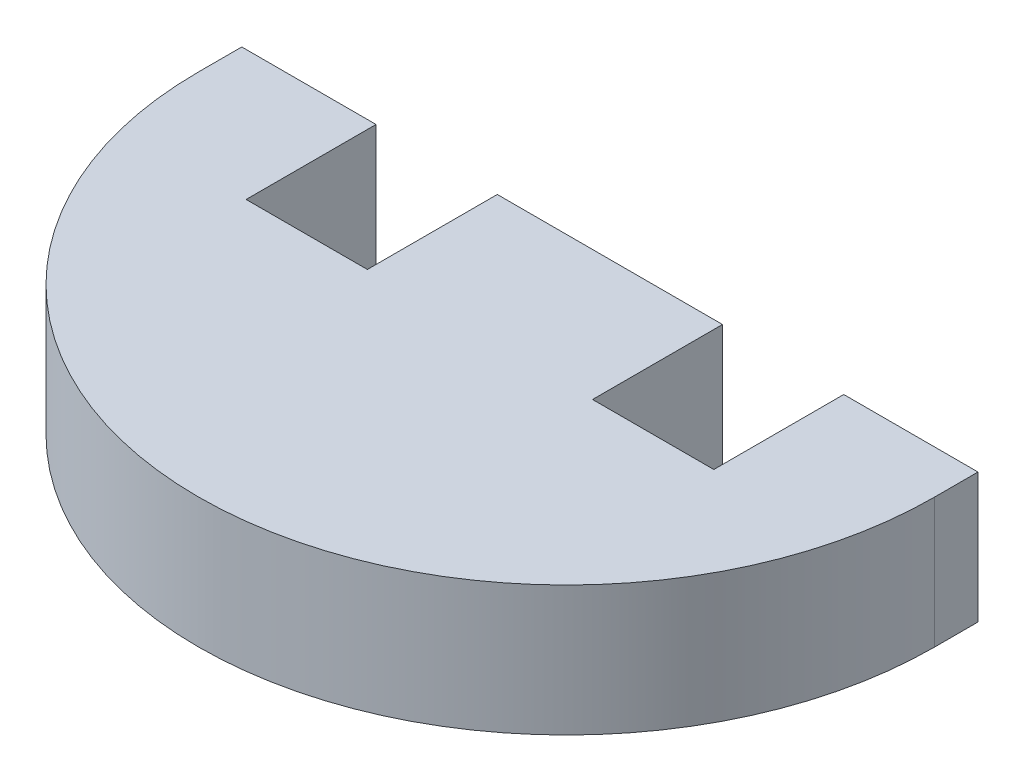
ISO-10303-21;
HEADER;
FILE_DESCRIPTION(('STEP AP214'),'2;1');
FILE_NAME('part.step','',(''),(''),'','','');
FILE_SCHEMA(('AUTOMOTIVE_DESIGN { 1 0 10303 214 1 1 1 1 }'));
ENDSEC;
DATA;
#1=APPLICATION_CONTEXT('core data for automotive mechanical design processes');
#2=APPLICATION_PROTOCOL_DEFINITION('international standard','automotive_design',2000,#1);
#3=PRODUCT_CONTEXT('',#1,'mechanical');
#4=PRODUCT('Part','Part','',(#3));
#5=PRODUCT_RELATED_PRODUCT_CATEGORY('part','',(#4));
#6=PRODUCT_DEFINITION_FORMATION('','',#4);
#7=PRODUCT_DEFINITION_CONTEXT('part definition',#1,'design');
#8=PRODUCT_DEFINITION('design','',#6,#7);
#9=PRODUCT_DEFINITION_SHAPE('','',#8);
#10=(LENGTH_UNIT() NAMED_UNIT(*) SI_UNIT(.MILLI.,.METRE.));
#11=(NAMED_UNIT(*) PLANE_ANGLE_UNIT() SI_UNIT($,.RADIAN.));
#12=(NAMED_UNIT(*) SI_UNIT($,.STERADIAN.) SOLID_ANGLE_UNIT());
#13=UNCERTAINTY_MEASURE_WITH_UNIT(LENGTH_MEASURE(1.E-05),#10,'distance_accuracy_value','');
#14=(GEOMETRIC_REPRESENTATION_CONTEXT(3) GLOBAL_UNCERTAINTY_ASSIGNED_CONTEXT((#13)) GLOBAL_UNIT_ASSIGNED_CONTEXT((#10,
#11,#12)) REPRESENTATION_CONTEXT('',''));
#15=CARTESIAN_POINT('',(0.,0.,0.));
#16=DIRECTION('',(0.,0.,1.));
#17=DIRECTION('',(1.,0.,0.));
#18=AXIS2_PLACEMENT_3D('',#15,#16,#17);
#19=CARTESIAN_POINT('',(-8.5,3.,-1.));
#20=DIRECTION('',(0.,0.,1.));
#21=DIRECTION('',(1.,0.,0.));
#22=AXIS2_PLACEMENT_3D('',#19,#20,#21);
#23=PLANE('',#22);
#24=DIRECTION('',(-1.,0.,0.));
#25=VECTOR('',#24,1.);
#26=CARTESIAN_POINT('',(-8.5,3.,-1.));
#27=LINE('',#26,#25);
#28=CARTESIAN_POINT('',(-5.4,3.,-1.));
#29=VERTEX_POINT('',#28);
#30=CARTESIAN_POINT('',(-8.5,3.,-1.));
#31=VERTEX_POINT('',#30);
#32=EDGE_CURVE('E221',#29,#31,#27,.T.);
#33=ORIENTED_EDGE('',*,*,#32,.F.);
#34=DIRECTION('',(0.,1.,0.));
#35=VECTOR('',#34,1.);
#36=CARTESIAN_POINT('',(-5.4,0.,-1.));
#37=LINE('',#36,#35);
#38=CARTESIAN_POINT('',(-5.4,0.,-1.));
#39=VERTEX_POINT('',#38);
#40=EDGE_CURVE('E170',#39,#29,#37,.T.);
#41=ORIENTED_EDGE('',*,*,#40,.F.);
#42=DIRECTION('',(-1.,0.,0.));
#43=VECTOR('',#42,1.);
#44=CARTESIAN_POINT('',(-8.5,0.,-1.));
#45=LINE('',#44,#43);
#46=CARTESIAN_POINT('',(-8.5,0.,-1.));
#47=VERTEX_POINT('',#46);
#48=EDGE_CURVE('E155',#39,#47,#45,.T.);
#49=ORIENTED_EDGE('',*,*,#48,.T.);
#50=DIRECTION('',(0.,-1.,0.));
#51=VECTOR('',#50,1.);
#52=CARTESIAN_POINT('',(-8.5,3.,-1.));
#53=LINE('',#52,#51);
#54=EDGE_CURVE('E247',#31,#47,#53,.T.);
#55=ORIENTED_EDGE('',*,*,#54,.F.);
#56=EDGE_LOOP('',(#33,#41,#49,#55));
#57=FACE_BOUND('',#56,.T.);
#58=ADVANCED_FACE('F43',(#57),#23,.F.);
#59=CARTESIAN_POINT('',(8.5,0.,-1.));
#60=VERTEX_POINT('',#59);
#61=CARTESIAN_POINT('',(5.4,0.,-1.));
#62=VERTEX_POINT('',#61);
#63=EDGE_CURVE('E237',#60,#62,#45,.T.);
#64=ORIENTED_EDGE('',*,*,#63,.T.);
#65=DIRECTION('',(0.,1.,0.));
#66=VECTOR('',#65,1.);
#67=CARTESIAN_POINT('',(5.4,0.,-1.));
#68=LINE('',#67,#66);
#69=CARTESIAN_POINT('',(5.4,3.,-1.));
#70=VERTEX_POINT('',#69);
#71=EDGE_CURVE('E180',#62,#70,#68,.T.);
#72=ORIENTED_EDGE('',*,*,#71,.T.);
#73=CARTESIAN_POINT('',(8.5,3.,-1.));
#74=VERTEX_POINT('',#73);
#75=EDGE_CURVE('E222',#74,#70,#27,.T.);
#76=ORIENTED_EDGE('',*,*,#75,.F.);
#77=DIRECTION('',(0.,-1.,0.));
#78=VECTOR('',#77,1.);
#79=CARTESIAN_POINT('',(8.5,3.,-1.));
#80=LINE('',#79,#78);
#81=EDGE_CURVE('E52',#74,#60,#80,.T.);
#82=ORIENTED_EDGE('',*,*,#81,.T.);
#83=EDGE_LOOP('',(#64,#72,#76,#82));
#84=FACE_BOUND('',#83,.T.);
#85=ADVANCED_FACE('F256',(#84),#23,.F.);
#86=CARTESIAN_POINT('',(0.,3.,0.));
#87=DIRECTION('',(0.,-1.,0.));
#88=DIRECTION('',(0.,0.,-1.));
#89=AXIS2_PLACEMENT_3D('',#86,#87,#88);
#90=CYLINDRICAL_SURFACE('',#89,8.5);
#91=CARTESIAN_POINT('',(0.,0.,0.));
#92=DIRECTION('',(0.,1.,0.));
#93=DIRECTION('',(0.,0.,1.));
#94=AXIS2_PLACEMENT_3D('',#91,#92,#93);
#95=CIRCLE('',#94,8.5);
#96=CARTESIAN_POINT('',(-8.5,0.,0.));
#97=VERTEX_POINT('',#96);
#98=CARTESIAN_POINT('',(8.5,0.,0.));
#99=VERTEX_POINT('',#98);
#100=EDGE_CURVE('E173',#97,#99,#95,.T.);
#101=ORIENTED_EDGE('',*,*,#100,.T.);
#102=DIRECTION('',(0.,-1.,0.));
#103=VECTOR('',#102,1.);
#104=CARTESIAN_POINT('',(8.5,3.,0.));
#105=LINE('',#104,#103);
#106=CARTESIAN_POINT('',(8.5,3.,0.));
#107=VERTEX_POINT('',#106);
#108=EDGE_CURVE('E11',#107,#99,#105,.T.);
#109=ORIENTED_EDGE('',*,*,#108,.F.);
#110=CARTESIAN_POINT('',(0.,3.,0.));
#111=DIRECTION('',(0.,1.,0.));
#112=DIRECTION('',(0.,0.,1.));
#113=AXIS2_PLACEMENT_3D('',#110,#111,#112);
#114=CIRCLE('',#113,8.5);
#115=CARTESIAN_POINT('',(-8.5,3.,0.));
#116=VERTEX_POINT('',#115);
#117=EDGE_CURVE('E213',#116,#107,#114,.T.);
#118=ORIENTED_EDGE('',*,*,#117,.F.);
#119=DIRECTION('',(0.,-1.,0.));
#120=VECTOR('',#119,1.);
#121=CARTESIAN_POINT('',(-8.5,3.,0.));
#122=LINE('',#121,#120);
#123=EDGE_CURVE('E230',#116,#97,#122,.T.);
#124=ORIENTED_EDGE('',*,*,#123,.T.);
#125=EDGE_LOOP('',(#101,#109,#118,#124));
#126=FACE_BOUND('',#125,.T.);
#127=ADVANCED_FACE('F45',(#126),#90,.T.);
#128=CARTESIAN_POINT('',(8.5,3.,-1.));
#129=DIRECTION('',(-1.,0.,0.));
#130=DIRECTION('',(0.,0.,1.));
#131=AXIS2_PLACEMENT_3D('',#128,#129,#130);
#132=PLANE('',#131);
#133=DIRECTION('',(0.,0.,-1.));
#134=VECTOR('',#133,1.);
#135=CARTESIAN_POINT('',(8.5,0.,-1.));
#136=LINE('',#135,#134);
#137=EDGE_CURVE('E234',#99,#60,#136,.T.);
#138=ORIENTED_EDGE('',*,*,#137,.T.);
#139=ORIENTED_EDGE('',*,*,#81,.F.);
#140=DIRECTION('',(0.,0.,-1.));
#141=VECTOR('',#140,1.);
#142=CARTESIAN_POINT('',(8.5,3.,-1.));
#143=LINE('',#142,#141);
#144=EDGE_CURVE('E217',#107,#74,#143,.T.);
#145=ORIENTED_EDGE('',*,*,#144,.F.);
#146=ORIENTED_EDGE('',*,*,#108,.T.);
#147=EDGE_LOOP('',(#138,#139,#145,#146));
#148=FACE_BOUND('',#147,.T.);
#149=ADVANCED_FACE('F268',(#148),#132,.F.);
#150=CARTESIAN_POINT('',(2.6,0.,-1.));
#151=VERTEX_POINT('',#150);
#152=CARTESIAN_POINT('',(-2.6,0.,-1.));
#153=VERTEX_POINT('',#152);
#154=EDGE_CURVE('E241',#151,#153,#45,.T.);
#155=ORIENTED_EDGE('',*,*,#154,.T.);
#156=DIRECTION('',(0.,1.,0.));
#157=VECTOR('',#156,1.);
#158=CARTESIAN_POINT('',(-2.6,0.,-1.));
#159=LINE('',#158,#157);
#160=CARTESIAN_POINT('',(-2.6,3.,-1.));
#161=VERTEX_POINT('',#160);
#162=EDGE_CURVE('E174',#153,#161,#159,.T.);
#163=ORIENTED_EDGE('',*,*,#162,.T.);
#164=CARTESIAN_POINT('',(2.6,3.,-1.));
#165=VERTEX_POINT('',#164);
#166=EDGE_CURVE('E227',#165,#161,#27,.T.);
#167=ORIENTED_EDGE('',*,*,#166,.F.);
#168=DIRECTION('',(0.,1.,0.));
#169=VECTOR('',#168,1.);
#170=CARTESIAN_POINT('',(2.6,0.,-1.));
#171=LINE('',#170,#169);
#172=EDGE_CURVE('E184',#151,#165,#171,.T.);
#173=ORIENTED_EDGE('',*,*,#172,.F.);
#174=EDGE_LOOP('',(#155,#163,#167,#173));
#175=FACE_BOUND('',#174,.T.);
#176=ADVANCED_FACE('F283',(#175),#23,.F.);
#177=CARTESIAN_POINT('',(-8.5,3.,0.));
#178=DIRECTION('',(1.,0.,0.));
#179=DIRECTION('',(0.,0.,-1.));
#180=AXIS2_PLACEMENT_3D('',#177,#178,#179);
#181=PLANE('',#180);
#182=DIRECTION('',(0.,0.,1.));
#183=VECTOR('',#182,1.);
#184=CARTESIAN_POINT('',(-8.5,0.,0.));
#185=LINE('',#184,#183);
#186=EDGE_CURVE('E218',#47,#97,#185,.T.);
#187=ORIENTED_EDGE('',*,*,#186,.T.);
#188=ORIENTED_EDGE('',*,*,#123,.F.);
#189=DIRECTION('',(0.,0.,1.));
#190=VECTOR('',#189,1.);
#191=CARTESIAN_POINT('',(-8.5,3.,0.));
#192=LINE('',#191,#190);
#193=EDGE_CURVE('E226',#31,#116,#192,.T.);
#194=ORIENTED_EDGE('',*,*,#193,.F.);
#195=ORIENTED_EDGE('',*,*,#54,.T.);
#196=EDGE_LOOP('',(#187,#188,#194,#195));
#197=FACE_BOUND('',#196,.T.);
#198=ADVANCED_FACE('F272',(#197),#181,.F.);
#199=CARTESIAN_POINT('',(0.,3.,0.));
#200=DIRECTION('',(0.,1.,0.));
#201=DIRECTION('',(0.,0.,1.));
#202=AXIS2_PLACEMENT_3D('',#199,#200,#201);
#203=PLANE('',#202);
#204=DIRECTION('',(0.,0.,1.));
#205=VECTOR('',#204,1.);
#206=CARTESIAN_POINT('',(-5.4,3.,-1.));
#207=LINE('',#206,#205);
#208=CARTESIAN_POINT('',(-5.4,3.,2.));
#209=VERTEX_POINT('',#208);
#210=EDGE_CURVE('E139',#29,#209,#207,.T.);
#211=ORIENTED_EDGE('',*,*,#210,.F.);
#212=ORIENTED_EDGE('',*,*,#32,.T.);
#213=ORIENTED_EDGE('',*,*,#193,.T.);
#214=ORIENTED_EDGE('',*,*,#117,.T.);
#215=ORIENTED_EDGE('',*,*,#144,.T.);
#216=ORIENTED_EDGE('',*,*,#75,.T.);
#217=DIRECTION('',(0.,0.,-1.));
#218=VECTOR('',#217,1.);
#219=CARTESIAN_POINT('',(5.4,3.,-1.));
#220=LINE('',#219,#218);
#221=CARTESIAN_POINT('',(5.4,3.,2.));
#222=VERTEX_POINT('',#221);
#223=EDGE_CURVE('E167',#222,#70,#220,.T.);
#224=ORIENTED_EDGE('',*,*,#223,.F.);
#225=DIRECTION('',(1.,0.,0.));
#226=VECTOR('',#225,1.);
#227=CARTESIAN_POINT('',(5.4,3.,2.));
#228=LINE('',#227,#226);
#229=CARTESIAN_POINT('',(2.6,3.,2.));
#230=VERTEX_POINT('',#229);
#231=EDGE_CURVE('E193',#230,#222,#228,.T.);
#232=ORIENTED_EDGE('',*,*,#231,.F.);
#233=DIRECTION('',(0.,0.,1.));
#234=VECTOR('',#233,1.);
#235=CARTESIAN_POINT('',(2.6,3.,-1.));
#236=LINE('',#235,#234);
#237=EDGE_CURVE('E197',#165,#230,#236,.T.);
#238=ORIENTED_EDGE('',*,*,#237,.F.);
#239=ORIENTED_EDGE('',*,*,#166,.T.);
#240=DIRECTION('',(0.,0.,-1.));
#241=VECTOR('',#240,1.);
#242=CARTESIAN_POINT('',(-2.6,3.,-1.));
#243=LINE('',#242,#241);
#244=CARTESIAN_POINT('',(-2.6,3.,2.));
#245=VERTEX_POINT('',#244);
#246=EDGE_CURVE('E157',#245,#161,#243,.T.);
#247=ORIENTED_EDGE('',*,*,#246,.F.);
#248=DIRECTION('',(1.,0.,0.));
#249=VECTOR('',#248,1.);
#250=CARTESIAN_POINT('',(-5.4,3.,2.));
#251=LINE('',#250,#249);
#252=EDGE_CURVE('E160',#209,#245,#251,.T.);
#253=ORIENTED_EDGE('',*,*,#252,.F.);
#254=EDGE_LOOP('',(#211,#212,#213,#214,#215,#216,#224,#232,#238,#239,#247,#253));
#255=FACE_BOUND('',#254,.T.);
#256=ADVANCED_FACE('F264',(#255),#203,.T.);
#257=CARTESIAN_POINT('',(0.,0.,0.));
#258=DIRECTION('',(0.,1.,0.));
#259=DIRECTION('',(0.,0.,1.));
#260=AXIS2_PLACEMENT_3D('',#257,#258,#259);
#261=PLANE('',#260);
#262=ORIENTED_EDGE('',*,*,#48,.F.);
#263=DIRECTION('',(0.,0.,1.));
#264=VECTOR('',#263,1.);
#265=CARTESIAN_POINT('',(-5.4,0.,-1.));
#266=LINE('',#265,#264);
#267=CARTESIAN_POINT('',(-5.4,0.,2.));
#268=VERTEX_POINT('',#267);
#269=EDGE_CURVE('E136',#39,#268,#266,.T.);
#270=ORIENTED_EDGE('',*,*,#269,.T.);
#271=DIRECTION('',(1.,0.,0.));
#272=VECTOR('',#271,1.);
#273=CARTESIAN_POINT('',(-5.4,0.,2.));
#274=LINE('',#273,#272);
#275=CARTESIAN_POINT('',(-2.6,0.,2.));
#276=VERTEX_POINT('',#275);
#277=EDGE_CURVE('E147',#268,#276,#274,.T.);
#278=ORIENTED_EDGE('',*,*,#277,.T.);
#279=DIRECTION('',(0.,0.,-1.));
#280=VECTOR('',#279,1.);
#281=CARTESIAN_POINT('',(-2.6,0.,-1.));
#282=LINE('',#281,#280);
#283=EDGE_CURVE('E59',#276,#153,#282,.T.);
#284=ORIENTED_EDGE('',*,*,#283,.T.);
#285=ORIENTED_EDGE('',*,*,#154,.F.);
#286=DIRECTION('',(0.,0.,1.));
#287=VECTOR('',#286,1.);
#288=CARTESIAN_POINT('',(2.6,0.,-1.));
#289=LINE('',#288,#287);
#290=CARTESIAN_POINT('',(2.6,0.,2.));
#291=VERTEX_POINT('',#290);
#292=EDGE_CURVE('E206',#151,#291,#289,.T.);
#293=ORIENTED_EDGE('',*,*,#292,.T.);
#294=DIRECTION('',(1.,0.,0.));
#295=VECTOR('',#294,1.);
#296=CARTESIAN_POINT('',(5.4,0.,2.));
#297=LINE('',#296,#295);
#298=CARTESIAN_POINT('',(5.4,0.,2.));
#299=VERTEX_POINT('',#298);
#300=EDGE_CURVE('E67',#291,#299,#297,.T.);
#301=ORIENTED_EDGE('',*,*,#300,.T.);
#302=DIRECTION('',(0.,0.,-1.));
#303=VECTOR('',#302,1.);
#304=CARTESIAN_POINT('',(5.4,0.,-1.));
#305=LINE('',#304,#303);
#306=EDGE_CURVE('E198',#299,#62,#305,.T.);
#307=ORIENTED_EDGE('',*,*,#306,.T.);
#308=ORIENTED_EDGE('',*,*,#63,.F.);
#309=ORIENTED_EDGE('',*,*,#137,.F.);
#310=ORIENTED_EDGE('',*,*,#100,.F.);
#311=ORIENTED_EDGE('',*,*,#186,.F.);
#312=EDGE_LOOP('',(#262,#270,#278,#284,#285,#293,#301,#307,#308,#309,#310,#311));
#313=FACE_BOUND('',#312,.T.);
#314=ADVANCED_FACE('F153',(#313),#261,.F.);
#315=CARTESIAN_POINT('',(5.4,0.,-1.));
#316=DIRECTION('',(1.,0.,0.));
#317=DIRECTION('',(0.,0.,-1.));
#318=AXIS2_PLACEMENT_3D('',#315,#316,#317);
#319=PLANE('',#318);
#320=ORIENTED_EDGE('',*,*,#223,.T.);
#321=ORIENTED_EDGE('',*,*,#71,.F.);
#322=ORIENTED_EDGE('',*,*,#306,.F.);
#323=DIRECTION('',(0.,1.,0.));
#324=VECTOR('',#323,1.);
#325=CARTESIAN_POINT('',(5.4,0.,2.));
#326=LINE('',#325,#324);
#327=EDGE_CURVE('E190',#299,#222,#326,.T.);
#328=ORIENTED_EDGE('',*,*,#327,.T.);
#329=EDGE_LOOP('',(#320,#321,#322,#328));
#330=FACE_BOUND('',#329,.T.);
#331=ADVANCED_FACE('F261',(#330),#319,.F.);
#332=CARTESIAN_POINT('',(5.4,0.,2.));
#333=DIRECTION('',(0.,0.,1.));
#334=DIRECTION('',(1.,0.,0.));
#335=AXIS2_PLACEMENT_3D('',#332,#333,#334);
#336=PLANE('',#335);
#337=ORIENTED_EDGE('',*,*,#231,.T.);
#338=ORIENTED_EDGE('',*,*,#327,.F.);
#339=ORIENTED_EDGE('',*,*,#300,.F.);
#340=DIRECTION('',(0.,1.,0.));
#341=VECTOR('',#340,1.);
#342=CARTESIAN_POINT('',(2.6,0.,2.));
#343=LINE('',#342,#341);
#344=EDGE_CURVE('E187',#291,#230,#343,.T.);
#345=ORIENTED_EDGE('',*,*,#344,.T.);
#346=EDGE_LOOP('',(#337,#338,#339,#345));
#347=FACE_BOUND('',#346,.T.);
#348=ADVANCED_FACE('F289',(#347),#336,.F.);
#349=CARTESIAN_POINT('',(2.6,0.,-1.));
#350=DIRECTION('',(-1.,0.,0.));
#351=DIRECTION('',(0.,0.,1.));
#352=AXIS2_PLACEMENT_3D('',#349,#350,#351);
#353=PLANE('',#352);
#354=ORIENTED_EDGE('',*,*,#237,.T.);
#355=ORIENTED_EDGE('',*,*,#344,.F.);
#356=ORIENTED_EDGE('',*,*,#292,.F.);
#357=ORIENTED_EDGE('',*,*,#172,.T.);
#358=EDGE_LOOP('',(#354,#355,#356,#357));
#359=FACE_BOUND('',#358,.T.);
#360=ADVANCED_FACE('F287',(#359),#353,.F.);
#361=CARTESIAN_POINT('',(-5.4,0.,-1.));
#362=DIRECTION('',(-1.,0.,0.));
#363=DIRECTION('',(0.,0.,1.));
#364=AXIS2_PLACEMENT_3D('',#361,#362,#363);
#365=PLANE('',#364);
#366=ORIENTED_EDGE('',*,*,#210,.T.);
#367=DIRECTION('',(0.,1.,0.));
#368=VECTOR('',#367,1.);
#369=CARTESIAN_POINT('',(-5.4,0.,2.));
#370=LINE('',#369,#368);
#371=EDGE_CURVE('E132',#268,#209,#370,.T.);
#372=ORIENTED_EDGE('',*,*,#371,.F.);
#373=ORIENTED_EDGE('',*,*,#269,.F.);
#374=ORIENTED_EDGE('',*,*,#40,.T.);
#375=EDGE_LOOP('',(#366,#372,#373,#374));
#376=FACE_BOUND('',#375,.T.);
#377=ADVANCED_FACE('F134',(#376),#365,.F.);
#378=CARTESIAN_POINT('',(-2.6,0.,-1.));
#379=DIRECTION('',(1.,0.,0.));
#380=DIRECTION('',(0.,0.,-1.));
#381=AXIS2_PLACEMENT_3D('',#378,#379,#380);
#382=PLANE('',#381);
#383=ORIENTED_EDGE('',*,*,#246,.T.);
#384=ORIENTED_EDGE('',*,*,#162,.F.);
#385=ORIENTED_EDGE('',*,*,#283,.F.);
#386=DIRECTION('',(0.,1.,0.));
#387=VECTOR('',#386,1.);
#388=CARTESIAN_POINT('',(-2.6,0.,2.));
#389=LINE('',#388,#387);
#390=EDGE_CURVE('E144',#276,#245,#389,.T.);
#391=ORIENTED_EDGE('',*,*,#390,.T.);
#392=EDGE_LOOP('',(#383,#384,#385,#391));
#393=FACE_BOUND('',#392,.T.);
#394=ADVANCED_FACE('F293',(#393),#382,.F.);
#395=CARTESIAN_POINT('',(-5.4,0.,2.));
#396=DIRECTION('',(0.,0.,1.));
#397=DIRECTION('',(1.,0.,0.));
#398=AXIS2_PLACEMENT_3D('',#395,#396,#397);
#399=PLANE('',#398);
#400=ORIENTED_EDGE('',*,*,#252,.T.);
#401=ORIENTED_EDGE('',*,*,#390,.F.);
#402=ORIENTED_EDGE('',*,*,#277,.F.);
#403=ORIENTED_EDGE('',*,*,#371,.T.);
#404=EDGE_LOOP('',(#400,#401,#402,#403));
#405=FACE_BOUND('',#404,.T.);
#406=ADVANCED_FACE('F148',(#405),#399,.F.);
#407=CLOSED_SHELL('',(#58,#85,#127,#149,#176,#198,#256,#314,#331,#348,#360,#377,#394,#406));
#408=MANIFOLD_SOLID_BREP('B2',#407);
#409=ADVANCED_BREP_SHAPE_REPRESENTATION('',(#18,#408),#14);
#410=SHAPE_DEFINITION_REPRESENTATION(#9,#409);
ENDSEC;
END-ISO-10303-21;
